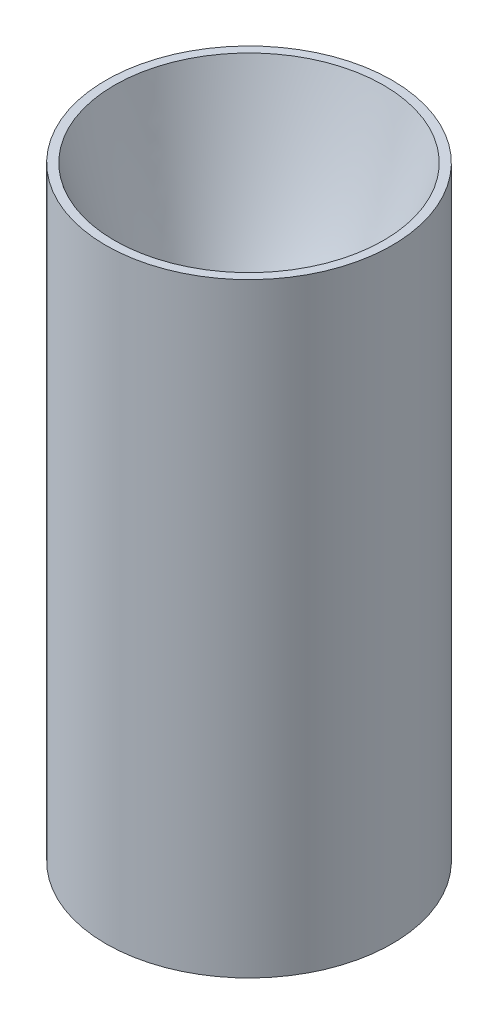
ISO-10303-21;
HEADER;
FILE_DESCRIPTION(('STEP AP214'),'2;1');
FILE_NAME('part.step','',(''),(''),'','','');
FILE_SCHEMA(('AUTOMOTIVE_DESIGN { 1 0 10303 214 1 1 1 1 }'));
ENDSEC;
DATA;
#1=APPLICATION_CONTEXT('core data for automotive mechanical design processes');
#2=APPLICATION_PROTOCOL_DEFINITION('international standard','automotive_design',2000,#1);
#3=PRODUCT_CONTEXT('',#1,'mechanical');
#4=PRODUCT('Part','Part','',(#3));
#5=PRODUCT_RELATED_PRODUCT_CATEGORY('part','',(#4));
#6=PRODUCT_DEFINITION_FORMATION('','',#4);
#7=PRODUCT_DEFINITION_CONTEXT('part definition',#1,'design');
#8=PRODUCT_DEFINITION('design','',#6,#7);
#9=PRODUCT_DEFINITION_SHAPE('','',#8);
#10=(LENGTH_UNIT() NAMED_UNIT(*) SI_UNIT(.MILLI.,.METRE.));
#11=(NAMED_UNIT(*) PLANE_ANGLE_UNIT() SI_UNIT($,.RADIAN.));
#12=(NAMED_UNIT(*) SI_UNIT($,.STERADIAN.) SOLID_ANGLE_UNIT());
#13=UNCERTAINTY_MEASURE_WITH_UNIT(LENGTH_MEASURE(1.E-05),#10,'distance_accuracy_value','');
#14=(GEOMETRIC_REPRESENTATION_CONTEXT(3) GLOBAL_UNCERTAINTY_ASSIGNED_CONTEXT((#13)) GLOBAL_UNIT_ASSIGNED_CONTEXT((#10,
#11,#12)) REPRESENTATION_CONTEXT('',''));
#15=CARTESIAN_POINT('',(0.,0.,0.));
#16=DIRECTION('',(0.,0.,1.));
#17=DIRECTION('',(1.,0.,0.));
#18=AXIS2_PLACEMENT_3D('',#15,#16,#17);
#19=CARTESIAN_POINT('',(26.7062113287053,6.50923965033825,0.));
#20=CARTESIAN_POINT('',(26.6554523867853,6.45847884124841,0.));
#21=CARTESIAN_POINT('',(26.5813741961518,6.38212177902064,0.));
#22=CARTESIAN_POINT('',(26.4154873738352,6.20864164611654,0.));
#23=CARTESIAN_POINT('',(26.2772778817675,6.04995163656635,0.));
#24=CARTESIAN_POINT('',(26.089808500155,5.83291364729743,0.));
#25=CARTESIAN_POINT('',(25.9153376003489,5.61072754276574,0.));
#26=CARTESIAN_POINT('',(25.7027203959471,5.32551893593357,0.));
#27=CARTESIAN_POINT('',(25.5134468469557,5.04570386122365,0.));
#28=CARTESIAN_POINT('',(25.3274206305271,4.75130157548285,0.));
#29=CARTESIAN_POINT('',(25.1569443484507,4.45478312275658,0.));
#30=CARTESIAN_POINT('',(24.995002426509,4.14928218433454,0.));
#31=CARTESIAN_POINT('',(24.8462181027666,3.83966673272222,0.));
#32=CARTESIAN_POINT('',(24.7081288971286,3.52362715719563,0.));
#33=CARTESIAN_POINT('',(24.5825511965105,3.20334704099946,0.));
#34=CARTESIAN_POINT('',(24.4686735390696,2.87809264472723,0.));
#35=CARTESIAN_POINT('',(24.3672556972351,2.54923942069524,0.));
#36=CARTESIAN_POINT('',(24.2780737272776,2.21635441997579,0.));
#37=CARTESIAN_POINT('',(24.2014758273978,1.88099677694374,0.));
#38=CARTESIAN_POINT('',(24.1374314313173,1.54205049780854,0.));
#39=CARTESIAN_POINT('',(24.0861168447955,1.20253727286862,0.));
#40=CARTESIAN_POINT('',(24.0523672130417,0.901433327840423,0.));
#41=CARTESIAN_POINT('',(24.0314657247247,0.646764266269616,0.));
#42=CARTESIAN_POINT('',(24.0193936938296,0.427064117093707,0.));
#43=CARTESIAN_POINT('',(24.0129558487222,0.267641069384235,0.));
#44=CARTESIAN_POINT('',(24.0105384573959,0.11011368951911,0.));
#45=CARTESIAN_POINT('',(24.0100006264442,0.0358926521759333,0.));
#46=CARTESIAN_POINT('',(24.01,1.20494413205813E-13,0.));
#47=B_SPLINE_CURVE_WITH_KNOTS('',4,(#19,#20,#21,#22,#23,#24,#25,#26,#27,#28,#29,#30,#31,#32,#33,
#34,#35,#36,#37,#38,#39,#40,#41,#42,#43,#44,#45,#46),.UNSPECIFIED.,.F.,.F.,(5,1,1,1,1,1,1,1,1,1,
1,1,1,1,1,1,1,1,1,1,1,1,1,1,5),(0.0825688161645696,0.122284452541055,0.142142270729318,
0.162000088917581,0.201715725294151,0.241431361670644,0.281146998047181,0.320862634423759,
0.360578270800262,0.400293907176806,0.440009543553384,0.479725179929891,0.519440816306429,
0.55915645268299,0.598872089059496,0.638587725436031,0.678303361812587,0.718018998189109,
0.75773463456565,0.797450270942201,0.837165907318734,0.857023725507005,0.876881543695275,
0.896739361883545,0.916597180071815),.UNSPECIFIED.);
#48=CARTESIAN_POINT('',(0.,0.,0.));
#49=DIRECTION('',(0.,1.,0.));
#50=AXIS1_PLACEMENT('',#48,#49);
#51=SURFACE_OF_REVOLUTION('',#47,#50);
#52=CARTESIAN_POINT('',(0.,-4.52382992584223E-09,0.));
#53=DIRECTION('',(0.,1.,0.));
#54=DIRECTION('',(0.,0.,1.));
#55=AXIS2_PLACEMENT_3D('',#52,#53,#54);
#56=CIRCLE('',#55,24.0100000000001);
#57=CARTESIAN_POINT('',(0.,-4.52382992584223E-09,24.0100000000001));
#58=VERTEX_POINT('',#57);
#59=EDGE_CURVE('E11',#58,#58,#56,.T.);
#60=ORIENTED_EDGE('',*,*,#59,.F.);
#61=EDGE_LOOP('',(#60));
#62=FACE_BOUND('',#61,.T.);
#63=CARTESIAN_POINT('',(0.,6.50923965033824,0.));
#64=DIRECTION('',(0.,1.,0.));
#65=DIRECTION('',(0.,0.,1.));
#66=AXIS2_PLACEMENT_3D('',#63,#64,#65);
#67=CIRCLE('',#66,26.7062113287053);
#68=CARTESIAN_POINT('',(0.,6.50923965033824,26.7062113287053));
#69=VERTEX_POINT('',#68);
#70=EDGE_CURVE('E132',#69,#69,#67,.T.);
#71=ORIENTED_EDGE('',*,*,#70,.T.);
#72=EDGE_LOOP('',(#71));
#73=FACE_BOUND('',#72,.T.);
#74=ADVANCED_FACE('F43',(#62,#73),#51,.T.);
#75=CARTESIAN_POINT('',(24.0100000000001,-4.52382992584223E-09,0.));
#76=CARTESIAN_POINT('',(24.0100012308518,-0.0705286470659472,0.));
#77=CARTESIAN_POINT('',(24.010530378306,-0.213584189693987,0.));
#78=CARTESIAN_POINT('',(24.0129060641596,-0.543182915887101,0.));
#79=CARTESIAN_POINT('',(24.0192304589117,-0.824160396612426,0.));
#80=CARTESIAN_POINT('',(24.0287155807421,-1.19482207151543,0.));
#81=CARTESIAN_POINT('',(24.0413578742,-1.51343505810577,0.));
#82=CARTESIAN_POINT('',(24.0571580988053,-1.86193960301196,0.));
#83=CARTESIAN_POINT('',(24.0761133579757,-2.19370687153936,0.));
#84=CARTESIAN_POINT('',(24.1037509729681,-2.61806939966552,0.));
#85=CARTESIAN_POINT('',(24.143219180703,-3.12203394655826,0.));
#86=CARTESIAN_POINT('',(24.2142318425549,-3.87997867466868,0.));
#87=CARTESIAN_POINT('',(24.3340588159477,-4.88645038793639,0.));
#88=CARTESIAN_POINT('',(24.5104181846956,-6.05671076009981,0.));
#89=CARTESIAN_POINT('',(24.7618173770714,-7.38516641453088,0.));
#90=CARTESIAN_POINT('',(25.062727460737,-8.70357451419277,0.));
#91=CARTESIAN_POINT('',(25.4127027740451,-10.0096372082404,0.));
#92=CARTESIAN_POINT('',(25.8112931373698,-11.3018195962222,0.));
#93=CARTESIAN_POINT('',(26.2578775488837,-12.5780993343875,0.));
#94=CARTESIAN_POINT('',(26.7519354830003,-13.8368874833426,0.));
#95=CARTESIAN_POINT('',(27.2926052852433,-15.0761971280278,0.));
#96=CARTESIAN_POINT('',(27.8794115530235,-16.2946097928945,0.));
#97=CARTESIAN_POINT('',(28.5110715670915,-17.4899387928883,0.));
#98=CARTESIAN_POINT('',(29.1874645682643,-18.6612877558523,0.));
#99=CARTESIAN_POINT('',(29.9063772771411,-19.8057433951625,0.));
#100=CARTESIAN_POINT('',(30.6689541775102,-20.9238600732815,0.));
#101=CARTESIAN_POINT('',(31.3700993731017,-21.8744117586503,0.));
#102=CARTESIAN_POINT('',(31.9996683054841,-22.6734454787298,0.));
#103=CARTESIAN_POINT('',(32.5350606005056,-23.3204221363905,0.));
#104=CARTESIAN_POINT('',(32.9831879534788,-23.8400050145822,0.));
#105=CARTESIAN_POINT('',(33.4193822127479,-24.3298162442334,0.));
#106=CARTESIAN_POINT('',(33.8467583090794,-24.7884843877114,0.));
#107=CARTESIAN_POINT('',(34.156490828318,-25.1138683080783,0.));
#108=CARTESIAN_POINT('',(34.4477921468583,-25.4096490446469,0.));
#109=CARTESIAN_POINT('',(34.547344615062,-25.5099499299107,0.));
#110=CARTESIAN_POINT('',(34.5972149928953,-25.5598221148951,0.));
#111=B_SPLINE_CURVE_WITH_KNOTS('',4,(#75,#76,#77,#78,#79,#80,#81,#82,#83,#84,#85,#86,#87,#88,
#89,#90,#91,#92,#93,#94,#95,#96,#97,#98,#99,#100,#101,#102,#103,#104,#105,#106,#107,#108,#109,
#110),.UNSPECIFIED.,.F.,.F.,(5,1,1,1,1,1,1,1,1,1,1,1,1,1,1,1,1,1,1,1,1,1,1,1,1,1,1,1,1,1,1,1,5),
(0.0826377293579618,0.0925749264345495,0.10251212335078,0.11244932026701,0.122386517183241,
0.132323714099471,0.142260911015702,0.152198107931932,0.162135304848163,0.182009698680624,
0.201884092513085,0.241632880178006,0.281381667842927,0.321130455507848,0.360879243172768,
0.400628030837689,0.44037681850261,0.480125606167531,0.519874393832452,0.559623181497373,
0.599371969162294,0.639120756827214,0.678869544492136,0.718618332157059,0.758367119821983,
0.798115907486907,0.817990301319368,0.837864695151829,0.857739088984291,0.877613482816753,
0.897487876649217,0.907425073565449,0.917362270319031),.UNSPECIFIED.);
#112=CARTESIAN_POINT('',(0.,0.,0.));
#113=DIRECTION('',(0.,1.,0.));
#114=AXIS1_PLACEMENT('',#112,#113);
#115=SURFACE_OF_REVOLUTION('',#111,#114);
#116=CARTESIAN_POINT('',(0.,-25.5598221117057,0.));
#117=DIRECTION('',(0.,1.,0.));
#118=DIRECTION('',(0.,0.,1.));
#119=AXIS2_PLACEMENT_3D('',#116,#117,#118);
#120=CIRCLE('',#119,34.5972149896735);
#121=CARTESIAN_POINT('',(0.,-25.5598221117057,34.5972149896735));
#122=VERTEX_POINT('',#121);
#123=EDGE_CURVE('E51',#122,#122,#120,.T.);
#124=ORIENTED_EDGE('',*,*,#123,.F.);
#125=EDGE_LOOP('',(#124));
#126=FACE_BOUND('',#125,.T.);
#127=ORIENTED_EDGE('',*,*,#59,.T.);
#128=EDGE_LOOP('',(#127));
#129=FACE_BOUND('',#128,.T.);
#130=ADVANCED_FACE('F151',(#126,#129),#115,.T.);
#131=CARTESIAN_POINT('',(0.,-25.5598221117057,0.));
#132=DIRECTION('',(0.,-1.,0.));
#133=DIRECTION('',(0.,0.,-1.));
#134=AXIS2_PLACEMENT_3D('',#131,#132,#133);
#135=CONICAL_SURFACE('',#134,34.5972149896735,0.785398163436918);
#136=CARTESIAN_POINT('',(0.,-34.1674502996624,0.));
#137=DIRECTION('',(0.,1.,0.));
#138=DIRECTION('',(0.,0.,1.));
#139=AXIS2_PLACEMENT_3D('',#136,#137,#138);
#140=CIRCLE('',#139,43.2048431783097);
#141=CARTESIAN_POINT('',(0.,-34.1674502996624,43.2048431783097));
#142=VERTEX_POINT('',#141);
#143=EDGE_CURVE('E209',#142,#142,#140,.T.);
#144=ORIENTED_EDGE('',*,*,#143,.F.);
#145=EDGE_LOOP('',(#144));
#146=FACE_BOUND('',#145,.T.);
#147=ORIENTED_EDGE('',*,*,#123,.T.);
#148=EDGE_LOOP('',(#147));
#149=FACE_BOUND('',#148,.T.);
#150=ADVANCED_FACE('F154',(#146,#149),#135,.F.);
#151=CARTESIAN_POINT('',(43.2048431783097,-34.1674502996624,0.));
#152=CARTESIAN_POINT('',(43.254715337891,-34.2173226978548,0.));
#153=CARTESIAN_POINT('',(43.3553242604632,-34.3186769291988,0.));
#154=CARTESIAN_POINT('',(43.58500459691,-34.5517100897781,0.));
#155=CARTESIAN_POINT('',(43.7848568169995,-34.7605007878418,0.));
#156=CARTESIAN_POINT('',(44.0923896993112,-35.0847918183622,0.));
#157=CARTESIAN_POINT('',(44.4257083902588,-35.4471532866296,0.));
#158=CARTESIAN_POINT('',(44.8260591537302,-35.8944082575379,0.));
#159=CARTESIAN_POINT('',(45.2637498918353,-36.4035419020669,0.));
#160=CARTESIAN_POINT('',(45.8044701559397,-37.0558327363716,0.));
#161=CARTESIAN_POINT('',(46.4308012880053,-37.8516123918643,0.));
#162=CARTESIAN_POINT('',(47.1340343764134,-38.8042368379484,0.));
#163=CARTESIAN_POINT('',(47.8954077706532,-39.9211332473901,0.));
#164=CARTESIAN_POINT('',(48.6150574927695,-41.0663154610566,0.));
#165=CARTESIAN_POINT('',(49.2910525077326,-42.2372538134368,0.));
#166=CARTESIAN_POINT('',(49.9229932184258,-43.4328620932277,0.));
#167=CARTESIAN_POINT('',(50.5096660570207,-44.6511293642919,0.));
#168=CARTESIAN_POINT('',(51.0504526793793,-45.890568959998,0.));
#169=CARTESIAN_POINT('',(51.5444701636213,-47.1492956161268,0.));
#170=CARTESIAN_POINT('',(51.9352810845023,-48.2661297682614,0.));
#171=CARTESIAN_POINT('',(52.2402216965071,-49.233238281383,0.));
#172=CARTESIAN_POINT('',(52.5209465915437,-50.207649576206,0.));
#173=CARTESIAN_POINT('',(52.7773074985867,-51.1886996185019,0.));
#174=CARTESIAN_POINT('',(53.0029965763988,-52.1776033538827,0.));
#175=CARTESIAN_POINT('',(53.1977432229395,-53.1725857701448,0.));
#176=CARTESIAN_POINT('',(53.3676081983682,-54.1725959586661,0.));
#177=CARTESIAN_POINT('',(53.4883592828742,-55.0083263874434,0.));
#178=CARTESIAN_POINT('',(53.5882208827225,-55.8486408917357,0.));
#179=CARTESIAN_POINT('',(53.6671255619154,-56.6881586902042,0.));
#180=CARTESIAN_POINT('',(53.7113377318368,-57.2811204236693,0.));
#181=CARTESIAN_POINT('',(53.741350078454,-57.7817549668458,0.));
#182=CARTESIAN_POINT('',(53.7611009111116,-58.2129981457044,0.));
#183=CARTESIAN_POINT('',(53.7737438122835,-58.5327280114938,0.));
#184=CARTESIAN_POINT('',(53.7832293035651,-58.9049560163774,0.));
#185=CARTESIAN_POINT('',(53.7895539055528,-59.1817251400827,0.));
#186=CARTESIAN_POINT('',(53.7919297596037,-59.5155666265266,0.));
#187=CARTESIAN_POINT('',(53.7924589041706,-59.6571436801761,0.));
#188=CARTESIAN_POINT('',(53.7924601363152,-59.7276737333537,0.));
#189=B_SPLINE_CURVE_WITH_KNOTS('',4,(#151,#152,#153,#154,#155,#156,#157,#158,#159,#160,#161,
#162,#163,#164,#165,#166,#167,#168,#169,#170,#171,#172,#173,#174,#175,#176,#177,#178,#179,#180,
#181,#182,#183,#184,#185,#186,#187,#188),.UNSPECIFIED.,.F.,.F.,(5,1,1,1,1,1,1,1,1,1,1,1,1,1,1,1,
1,1,1,1,1,1,1,1,1,1,1,1,1,1,1,1,1,1,5),(0.0826377289308518,0.0925749252641085,0.102512122180341,
0.112449319096573,0.122386516012805,0.142260909845266,0.162135303677727,0.182009697510188,
0.201884091342649,0.24163287900757,0.281381666672492,0.321130454337413,0.360879242002335,
0.400628029667257,0.440376817332178,0.4801256049971,0.519874392662021,0.559623180326942,
0.599371967991863,0.619246361824324,0.639120755656786,0.678869543321707,0.718618330986628,
0.738492724819089,0.75836711865155,0.798115906316471,0.817990300148932,0.837864693981393,
0.857739087813854,0.867676284730084,0.877613481646315,0.887550678562545,0.897487875478776,
0.907425072395006,0.917362269898702),.UNSPECIFIED.);
#190=CARTESIAN_POINT('',(0.,0.,0.));
#191=DIRECTION('',(0.,1.,0.));
#192=AXIS1_PLACEMENT('',#190,#191);
#193=SURFACE_OF_REVOLUTION('',#189,#192);
#194=CARTESIAN_POINT('',(0.,-59.7276737499237,0.));
#195=DIRECTION('',(0.,1.,0.));
#196=DIRECTION('',(0.,0.,1.));
#197=AXIS2_PLACEMENT_3D('',#194,#195,#196);
#198=CIRCLE('',#197,53.7924601363156);
#199=CARTESIAN_POINT('',(0.,-59.7276737499237,53.7924601363156));
#200=VERTEX_POINT('',#199);
#201=EDGE_CURVE('E206',#200,#200,#198,.T.);
#202=ORIENTED_EDGE('',*,*,#201,.F.);
#203=EDGE_LOOP('',(#202));
#204=FACE_BOUND('',#203,.T.);
#205=ORIENTED_EDGE('',*,*,#143,.T.);
#206=EDGE_LOOP('',(#205));
#207=FACE_BOUND('',#206,.T.);
#208=ADVANCED_FACE('F158',(#204,#207),#193,.T.);
#209=CARTESIAN_POINT('',(0.,0.,0.));
#210=DIRECTION('',(0.,1.,0.));
#211=DIRECTION('',(0.,0.,1.));
#212=AXIS2_PLACEMENT_3D('',#209,#210,#211);
#213=CYLINDRICAL_SURFACE('',#212,53.7924601363156);
#214=CARTESIAN_POINT('',(0.,-212.127673749924,0.));
#215=DIRECTION('',(0.,1.,0.));
#216=DIRECTION('',(0.,0.,1.));
#217=AXIS2_PLACEMENT_3D('',#214,#215,#216);
#218=CIRCLE('',#217,53.7924601363156);
#219=CARTESIAN_POINT('',(0.,-212.127673749924,53.7924601363156));
#220=VERTEX_POINT('',#219);
#221=EDGE_CURVE('E203',#220,#220,#218,.T.);
#222=ORIENTED_EDGE('',*,*,#221,.F.);
#223=EDGE_LOOP('',(#222));
#224=FACE_BOUND('',#223,.T.);
#225=ORIENTED_EDGE('',*,*,#201,.T.);
#226=EDGE_LOOP('',(#225));
#227=FACE_BOUND('',#226,.T.);
#228=ADVANCED_FACE('F162',(#224,#227),#213,.F.);
#229=CARTESIAN_POINT('',(76.2,-212.127673749924,0.));
#230=DIRECTION('',(0.,1.,0.));
#231=DIRECTION('',(0.,0.,1.));
#232=AXIS2_PLACEMENT_3D('',#229,#230,#231);
#233=PLANE('',#232);
#234=CARTESIAN_POINT('',(47.1463446356136,-212.127673749924,47.1463446356125));
#235=DIRECTION('',(0.,-1.,0.));
#236=DIRECTION('',(0.,0.,-1.));
#237=AXIS2_PLACEMENT_3D('',#234,#235,#236);
#238=CIRCLE('',#237,4.21639999999999);
#239=CARTESIAN_POINT('',(47.1463446356136,-212.127673749924,42.9299446356125));
#240=VERTEX_POINT('',#239);
#241=EDGE_CURVE('E87',#240,#240,#238,.T.);
#242=ORIENTED_EDGE('',*,*,#241,.F.);
#243=EDGE_LOOP('',(#242));
#244=FACE_BOUND('',#243,.T.);
#245=CARTESIAN_POINT('',(6.98383554802098E-13,-212.127673749924,66.675));
#246=DIRECTION('',(0.,-1.,0.));
#247=DIRECTION('',(0.,0.,-1.));
#248=AXIS2_PLACEMENT_3D('',#245,#246,#247);
#249=CIRCLE('',#248,4.21639999999999);
#250=CARTESIAN_POINT('',(6.98383554802098E-13,-212.127673749924,62.4586));
#251=VERTEX_POINT('',#250);
#252=EDGE_CURVE('E86',#251,#251,#249,.T.);
#253=ORIENTED_EDGE('',*,*,#252,.F.);
#254=EDGE_LOOP('',(#253));
#255=FACE_BOUND('',#254,.T.);
#256=CARTESIAN_POINT('',(-47.1463446356126,-212.127673749924,47.1463446356135));
#257=DIRECTION('',(0.,-1.,0.));
#258=DIRECTION('',(0.,0.,-1.));
#259=AXIS2_PLACEMENT_3D('',#256,#257,#258);
#260=CIRCLE('',#259,4.21639999999999);
#261=CARTESIAN_POINT('',(-47.1463446356126,-212.127673749924,42.9299446356135));
#262=VERTEX_POINT('',#261);
#263=EDGE_CURVE('E97',#262,#262,#260,.T.);
#264=ORIENTED_EDGE('',*,*,#263,.F.);
#265=EDGE_LOOP('',(#264));
#266=FACE_BOUND('',#265,.T.);
#267=CARTESIAN_POINT('',(-66.675,-212.127673749924,0.));
#268=DIRECTION('',(0.,-1.,0.));
#269=DIRECTION('',(0.,0.,-1.));
#270=AXIS2_PLACEMENT_3D('',#267,#268,#269);
#271=CIRCLE('',#270,4.21639999999999);
#272=CARTESIAN_POINT('',(-66.675,-212.127673749924,-4.21639999999999));
#273=VERTEX_POINT('',#272);
#274=EDGE_CURVE('E103',#273,#273,#271,.T.);
#275=ORIENTED_EDGE('',*,*,#274,.F.);
#276=EDGE_LOOP('',(#275));
#277=FACE_BOUND('',#276,.T.);
#278=CARTESIAN_POINT('',(-47.1463446356133,-212.127673749924,-47.1463446356128));
#279=DIRECTION('',(0.,-1.,0.));
#280=DIRECTION('',(0.,0.,-1.));
#281=AXIS2_PLACEMENT_3D('',#278,#279,#280);
#282=CIRCLE('',#281,4.21639999999999);
#283=CARTESIAN_POINT('',(-47.1463446356133,-212.127673749924,-51.3627446356128));
#284=VERTEX_POINT('',#283);
#285=EDGE_CURVE('E109',#284,#284,#282,.T.);
#286=ORIENTED_EDGE('',*,*,#285,.F.);
#287=EDGE_LOOP('',(#286));
#288=FACE_BOUND('',#287,.T.);
#289=CARTESIAN_POINT('',(-2.32794518267366E-13,-212.127673749924,-66.675));
#290=DIRECTION('',(0.,-1.,0.));
#291=DIRECTION('',(0.,0.,-1.));
#292=AXIS2_PLACEMENT_3D('',#289,#290,#291);
#293=CIRCLE('',#292,4.21639999999999);
#294=CARTESIAN_POINT('',(-2.32794518267366E-13,-212.127673749924,-70.8914));
#295=VERTEX_POINT('',#294);
#296=EDGE_CURVE('E115',#295,#295,#293,.T.);
#297=ORIENTED_EDGE('',*,*,#296,.F.);
#298=EDGE_LOOP('',(#297));
#299=FACE_BOUND('',#298,.T.);
#300=CARTESIAN_POINT('',(47.146344635613,-212.127673749924,-47.1463446356132));
#301=DIRECTION('',(0.,-1.,0.));
#302=DIRECTION('',(0.,0.,-1.));
#303=AXIS2_PLACEMENT_3D('',#300,#301,#302);
#304=CIRCLE('',#303,4.21639999999999);
#305=CARTESIAN_POINT('',(47.146344635613,-212.127673749924,-51.3627446356131));
#306=VERTEX_POINT('',#305);
#307=EDGE_CURVE('E121',#306,#306,#304,.T.);
#308=ORIENTED_EDGE('',*,*,#307,.F.);
#309=EDGE_LOOP('',(#308));
#310=FACE_BOUND('',#309,.T.);
#311=CARTESIAN_POINT('',(66.675,-212.127673749924,0.));
#312=DIRECTION('',(0.,-1.,0.));
#313=DIRECTION('',(0.,0.,-1.));
#314=AXIS2_PLACEMENT_3D('',#311,#312,#313);
#315=CIRCLE('',#314,4.21639999999999);
#316=CARTESIAN_POINT('',(66.675,-212.127673749924,-4.21639999999999));
#317=VERTEX_POINT('',#316);
#318=EDGE_CURVE('E127',#317,#317,#315,.T.);
#319=ORIENTED_EDGE('',*,*,#318,.F.);
#320=EDGE_LOOP('',(#319));
#321=FACE_BOUND('',#320,.T.);
#322=CARTESIAN_POINT('',(0.,-212.127673749924,0.));
#323=DIRECTION('',(0.,1.,0.));
#324=DIRECTION('',(0.,0.,1.));
#325=AXIS2_PLACEMENT_3D('',#322,#323,#324);
#326=CIRCLE('',#325,76.2);
#327=CARTESIAN_POINT('',(0.,-212.127673749924,76.2));
#328=VERTEX_POINT('',#327);
#329=EDGE_CURVE('E200',#328,#328,#326,.T.);
#330=ORIENTED_EDGE('',*,*,#329,.F.);
#331=EDGE_LOOP('',(#330));
#332=FACE_BOUND('',#331,.T.);
#333=ORIENTED_EDGE('',*,*,#221,.T.);
#334=EDGE_LOOP('',(#333));
#335=FACE_BOUND('',#334,.T.);
#336=ADVANCED_FACE('F166',(#244,#255,#266,#277,#288,#299,#310,#321,#332,#335),#233,.F.);
#337=CARTESIAN_POINT('',(0.,0.,0.));
#338=DIRECTION('',(0.,1.,0.));
#339=DIRECTION('',(0.,0.,1.));
#340=AXIS2_PLACEMENT_3D('',#337,#338,#339);
#341=CYLINDRICAL_SURFACE('',#340,76.2);
#342=CARTESIAN_POINT('',(0.,109.927347076635,0.));
#343=DIRECTION('',(0.,1.,0.));
#344=DIRECTION('',(0.,0.,1.));
#345=AXIS2_PLACEMENT_3D('',#342,#343,#344);
#346=CIRCLE('',#345,76.2);
#347=CARTESIAN_POINT('',(0.,109.927347076635,76.2));
#348=VERTEX_POINT('',#347);
#349=EDGE_CURVE('E197',#348,#348,#346,.T.);
#350=ORIENTED_EDGE('',*,*,#349,.F.);
#351=EDGE_LOOP('',(#350));
#352=FACE_BOUND('',#351,.T.);
#353=ORIENTED_EDGE('',*,*,#329,.T.);
#354=EDGE_LOOP('',(#353));
#355=FACE_BOUND('',#354,.T.);
#356=ADVANCED_FACE('F170',(#352,#355),#341,.T.);
#357=CARTESIAN_POINT('',(71.6384554787615,109.927347076635,0.));
#358=DIRECTION('',(0.,-1.,0.));
#359=DIRECTION('',(0.,0.,-1.));
#360=AXIS2_PLACEMENT_3D('',#357,#358,#359);
#361=PLANE('',#360);
#362=CARTESIAN_POINT('',(0.,109.927347076635,0.));
#363=DIRECTION('',(0.,1.,0.));
#364=DIRECTION('',(0.,0.,1.));
#365=AXIS2_PLACEMENT_3D('',#362,#363,#364);
#366=CIRCLE('',#365,71.6384554787615);
#367=CARTESIAN_POINT('',(0.,109.927347076635,71.6384554787615));
#368=VERTEX_POINT('',#367);
#369=EDGE_CURVE('E194',#368,#368,#366,.T.);
#370=ORIENTED_EDGE('',*,*,#369,.F.);
#371=EDGE_LOOP('',(#370));
#372=FACE_BOUND('',#371,.T.);
#373=ORIENTED_EDGE('',*,*,#349,.T.);
#374=EDGE_LOOP('',(#373));
#375=FACE_BOUND('',#374,.T.);
#376=ADVANCED_FACE('F174',(#372,#375),#361,.F.);
#377=CARTESIAN_POINT('',(71.6384554787615,109.927347076635,0.));
#378=CARTESIAN_POINT('',(49.1723334607279,34.6359542236987,0.));
#379=CARTESIAN_POINT('',(26.7062113287053,6.50923965033824,0.));
#380=B_SPLINE_CURVE_WITH_KNOTS('',2,(#377,#378,#379),.UNSPECIFIED.,.F.,.F.,(3,3),(0.,1.),.UNSPECIFIED.);
#381=CARTESIAN_POINT('',(0.,0.,0.));
#382=DIRECTION('',(0.,1.,0.));
#383=AXIS1_PLACEMENT('',#381,#382);
#384=SURFACE_OF_REVOLUTION('',#380,#383);
#385=ORIENTED_EDGE('',*,*,#70,.F.);
#386=EDGE_LOOP('',(#385));
#387=FACE_BOUND('',#386,.T.);
#388=ORIENTED_EDGE('',*,*,#369,.T.);
#389=EDGE_LOOP('',(#388));
#390=FACE_BOUND('',#389,.T.);
#391=ADVANCED_FACE('F178',(#387,#390),#384,.T.);
#392=CARTESIAN_POINT('',(66.675,-187.126453749924,0.));
#393=DIRECTION('',(0.,-1.,0.));
#394=DIRECTION('',(0.,0.,-1.));
#395=AXIS2_PLACEMENT_3D('',#392,#393,#394);
#396=CONICAL_SURFACE('',#395,4.21639999999999,1.02974425867665);
#397=CARTESIAN_POINT('',(66.675,-184.592985035856,0.));
#398=VERTEX_POINT('',#397);
#399=VERTEX_LOOP('',#398);
#400=FACE_BOUND('',#399,.T.);
#401=CARTESIAN_POINT('',(66.675,-187.126453749924,0.));
#402=DIRECTION('',(0.,-1.,0.));
#403=DIRECTION('',(0.,0.,-1.));
#404=AXIS2_PLACEMENT_3D('',#401,#402,#403);
#405=CIRCLE('',#404,4.21639999999999);
#406=CARTESIAN_POINT('',(66.675,-187.126453749924,-4.21639999999999));
#407=VERTEX_POINT('',#406);
#408=EDGE_CURVE('E130',#407,#407,#405,.T.);
#409=ORIENTED_EDGE('',*,*,#408,.T.);
#410=EDGE_LOOP('',(#409));
#411=FACE_BOUND('',#410,.T.);
#412=ADVANCED_FACE('F182',(#400,#411),#396,.F.);
#413=CARTESIAN_POINT('',(66.675,-212.127673749924,0.));
#414=DIRECTION('',(0.,-1.,0.));
#415=DIRECTION('',(0.,0.,-1.));
#416=AXIS2_PLACEMENT_3D('',#413,#414,#415);
#417=CYLINDRICAL_SURFACE('',#416,4.21639999999999);
#418=ORIENTED_EDGE('',*,*,#408,.F.);
#419=EDGE_LOOP('',(#418));
#420=FACE_BOUND('',#419,.T.);
#421=ORIENTED_EDGE('',*,*,#318,.T.);
#422=EDGE_LOOP('',(#421));
#423=FACE_BOUND('',#422,.T.);
#424=ADVANCED_FACE('F275',(#420,#423),#417,.F.);
#425=CARTESIAN_POINT('',(47.146344635613,-187.126453749924,-47.1463446356132));
#426=DIRECTION('',(0.,-1.,0.));
#427=DIRECTION('',(0.,0.,-1.));
#428=AXIS2_PLACEMENT_3D('',#425,#426,#427);
#429=CONICAL_SURFACE('',#428,4.21639999999999,1.02974425867665);
#430=CARTESIAN_POINT('',(47.146344635613,-184.592985035856,-47.1463446356132));
#431=VERTEX_POINT('',#430);
#432=VERTEX_LOOP('',#431);
#433=FACE_BOUND('',#432,.T.);
#434=CARTESIAN_POINT('',(47.146344635613,-187.126453749924,-47.1463446356132));
#435=DIRECTION('',(0.,-1.,0.));
#436=DIRECTION('',(0.,0.,-1.));
#437=AXIS2_PLACEMENT_3D('',#434,#435,#436);
#438=CIRCLE('',#437,4.21639999999999);
#439=CARTESIAN_POINT('',(47.146344635613,-187.126453749924,-51.3627446356131));
#440=VERTEX_POINT('',#439);
#441=EDGE_CURVE('E124',#440,#440,#438,.T.);
#442=ORIENTED_EDGE('',*,*,#441,.T.);
#443=EDGE_LOOP('',(#442));
#444=FACE_BOUND('',#443,.T.);
#445=ADVANCED_FACE('F282',(#433,#444),#429,.F.);
#446=CARTESIAN_POINT('',(47.146344635613,-212.127673749924,-47.1463446356132));
#447=DIRECTION('',(0.,-1.,0.));
#448=DIRECTION('',(0.,0.,-1.));
#449=AXIS2_PLACEMENT_3D('',#446,#447,#448);
#450=CYLINDRICAL_SURFACE('',#449,4.21639999999999);
#451=ORIENTED_EDGE('',*,*,#441,.F.);
#452=EDGE_LOOP('',(#451));
#453=FACE_BOUND('',#452,.T.);
#454=ORIENTED_EDGE('',*,*,#307,.T.);
#455=EDGE_LOOP('',(#454));
#456=FACE_BOUND('',#455,.T.);
#457=ADVANCED_FACE('F291',(#453,#456),#450,.F.);
#458=CARTESIAN_POINT('',(-2.32794518267366E-13,-187.126453749924,-66.675));
#459=DIRECTION('',(0.,-1.,0.));
#460=DIRECTION('',(0.,0.,-1.));
#461=AXIS2_PLACEMENT_3D('',#458,#459,#460);
#462=CONICAL_SURFACE('',#461,4.21639999999999,1.02974425867665);
#463=CARTESIAN_POINT('',(-2.39538571947206E-13,-184.592985035856,-66.675));
#464=VERTEX_POINT('',#463);
#465=VERTEX_LOOP('',#464);
#466=FACE_BOUND('',#465,.T.);
#467=CARTESIAN_POINT('',(-2.32794518267366E-13,-187.126453749924,-66.675));
#468=DIRECTION('',(0.,-1.,0.));
#469=DIRECTION('',(0.,0.,-1.));
#470=AXIS2_PLACEMENT_3D('',#467,#468,#469);
#471=CIRCLE('',#470,4.21639999999999);
#472=CARTESIAN_POINT('',(-2.32794518267366E-13,-187.126453749924,-70.8914));
#473=VERTEX_POINT('',#472);
#474=EDGE_CURVE('E118',#473,#473,#471,.T.);
#475=ORIENTED_EDGE('',*,*,#474,.T.);
#476=EDGE_LOOP('',(#475));
#477=FACE_BOUND('',#476,.T.);
#478=ADVANCED_FACE('F300',(#466,#477),#462,.F.);
#479=CARTESIAN_POINT('',(-2.32794518267366E-13,-212.127673749924,-66.675));
#480=DIRECTION('',(0.,-1.,0.));
#481=DIRECTION('',(0.,0.,-1.));
#482=AXIS2_PLACEMENT_3D('',#479,#480,#481);
#483=CYLINDRICAL_SURFACE('',#482,4.21639999999999);
#484=ORIENTED_EDGE('',*,*,#474,.F.);
#485=EDGE_LOOP('',(#484));
#486=FACE_BOUND('',#485,.T.);
#487=ORIENTED_EDGE('',*,*,#296,.T.);
#488=EDGE_LOOP('',(#487));
#489=FACE_BOUND('',#488,.T.);
#490=ADVANCED_FACE('F309',(#486,#489),#483,.F.);
#491=CARTESIAN_POINT('',(-47.1463446356133,-187.126453749924,-47.1463446356128));
#492=DIRECTION('',(0.,-1.,0.));
#493=DIRECTION('',(0.,0.,-1.));
#494=AXIS2_PLACEMENT_3D('',#491,#492,#493);
#495=CONICAL_SURFACE('',#494,4.21639999999999,1.02974425867665);
#496=CARTESIAN_POINT('',(-47.1463446356133,-184.592985035856,-47.1463446356128));
#497=VERTEX_POINT('',#496);
#498=VERTEX_LOOP('',#497);
#499=FACE_BOUND('',#498,.T.);
#500=CARTESIAN_POINT('',(-47.1463446356133,-187.126453749924,-47.1463446356128));
#501=DIRECTION('',(0.,-1.,0.));
#502=DIRECTION('',(0.,0.,-1.));
#503=AXIS2_PLACEMENT_3D('',#500,#501,#502);
#504=CIRCLE('',#503,4.21639999999999);
#505=CARTESIAN_POINT('',(-47.1463446356133,-187.126453749924,-51.3627446356128));
#506=VERTEX_POINT('',#505);
#507=EDGE_CURVE('E112',#506,#506,#504,.T.);
#508=ORIENTED_EDGE('',*,*,#507,.T.);
#509=EDGE_LOOP('',(#508));
#510=FACE_BOUND('',#509,.T.);
#511=ADVANCED_FACE('F318',(#499,#510),#495,.F.);
#512=CARTESIAN_POINT('',(-47.1463446356133,-212.127673749924,-47.1463446356128));
#513=DIRECTION('',(0.,-1.,0.));
#514=DIRECTION('',(0.,0.,-1.));
#515=AXIS2_PLACEMENT_3D('',#512,#513,#514);
#516=CYLINDRICAL_SURFACE('',#515,4.21639999999999);
#517=ORIENTED_EDGE('',*,*,#507,.F.);
#518=EDGE_LOOP('',(#517));
#519=FACE_BOUND('',#518,.T.);
#520=ORIENTED_EDGE('',*,*,#285,.T.);
#521=EDGE_LOOP('',(#520));
#522=FACE_BOUND('',#521,.T.);
#523=ADVANCED_FACE('F328',(#519,#522),#516,.F.);
#524=CARTESIAN_POINT('',(-66.675,-187.126453749924,0.));
#525=DIRECTION('',(0.,-1.,0.));
#526=DIRECTION('',(0.,0.,-1.));
#527=AXIS2_PLACEMENT_3D('',#524,#525,#526);
#528=CONICAL_SURFACE('',#527,4.21639999999999,1.02974425867665);
#529=CARTESIAN_POINT('',(-66.675,-184.592985035856,0.));
#530=VERTEX_POINT('',#529);
#531=VERTEX_LOOP('',#530);
#532=FACE_BOUND('',#531,.T.);
#533=CARTESIAN_POINT('',(-66.675,-187.126453749924,0.));
#534=DIRECTION('',(0.,-1.,0.));
#535=DIRECTION('',(0.,0.,-1.));
#536=AXIS2_PLACEMENT_3D('',#533,#534,#535);
#537=CIRCLE('',#536,4.21639999999999);
#538=CARTESIAN_POINT('',(-66.675,-187.126453749924,-4.21639999999999));
#539=VERTEX_POINT('',#538);
#540=EDGE_CURVE('E106',#539,#539,#537,.T.);
#541=ORIENTED_EDGE('',*,*,#540,.T.);
#542=EDGE_LOOP('',(#541));
#543=FACE_BOUND('',#542,.T.);
#544=ADVANCED_FACE('F336',(#532,#543),#528,.F.);
#545=CARTESIAN_POINT('',(-66.675,-212.127673749924,0.));
#546=DIRECTION('',(0.,-1.,0.));
#547=DIRECTION('',(0.,0.,-1.));
#548=AXIS2_PLACEMENT_3D('',#545,#546,#547);
#549=CYLINDRICAL_SURFACE('',#548,4.21639999999999);
#550=ORIENTED_EDGE('',*,*,#540,.F.);
#551=EDGE_LOOP('',(#550));
#552=FACE_BOUND('',#551,.T.);
#553=ORIENTED_EDGE('',*,*,#274,.T.);
#554=EDGE_LOOP('',(#553));
#555=FACE_BOUND('',#554,.T.);
#556=ADVANCED_FACE('F345',(#552,#555),#549,.F.);
#557=CARTESIAN_POINT('',(-47.1463446356126,-187.126453749924,47.1463446356135));
#558=DIRECTION('',(0.,-1.,0.));
#559=DIRECTION('',(0.,0.,-1.));
#560=AXIS2_PLACEMENT_3D('',#557,#558,#559);
#561=CONICAL_SURFACE('',#560,4.21639999999999,1.02974425867665);
#562=CARTESIAN_POINT('',(-47.1463446356127,-184.592985035856,47.1463446356135));
#563=VERTEX_POINT('',#562);
#564=VERTEX_LOOP('',#563);
#565=FACE_BOUND('',#564,.T.);
#566=CARTESIAN_POINT('',(-47.1463446356126,-187.126453749924,47.1463446356135));
#567=DIRECTION('',(0.,-1.,0.));
#568=DIRECTION('',(0.,0.,-1.));
#569=AXIS2_PLACEMENT_3D('',#566,#567,#568);
#570=CIRCLE('',#569,4.21639999999999);
#571=CARTESIAN_POINT('',(-47.1463446356126,-187.126453749924,42.9299446356135));
#572=VERTEX_POINT('',#571);
#573=EDGE_CURVE('E100',#572,#572,#570,.T.);
#574=ORIENTED_EDGE('',*,*,#573,.T.);
#575=EDGE_LOOP('',(#574));
#576=FACE_BOUND('',#575,.T.);
#577=ADVANCED_FACE('F353',(#565,#576),#561,.F.);
#578=CARTESIAN_POINT('',(-47.1463446356126,-212.127673749924,47.1463446356135));
#579=DIRECTION('',(0.,-1.,0.));
#580=DIRECTION('',(0.,0.,-1.));
#581=AXIS2_PLACEMENT_3D('',#578,#579,#580);
#582=CYLINDRICAL_SURFACE('',#581,4.21639999999999);
#583=ORIENTED_EDGE('',*,*,#573,.F.);
#584=EDGE_LOOP('',(#583));
#585=FACE_BOUND('',#584,.T.);
#586=ORIENTED_EDGE('',*,*,#263,.T.);
#587=EDGE_LOOP('',(#586));
#588=FACE_BOUND('',#587,.T.);
#589=ADVANCED_FACE('F362',(#585,#588),#582,.F.);
#590=CARTESIAN_POINT('',(6.98383554802098E-13,-187.126453749924,66.675));
#591=DIRECTION('',(0.,-1.,0.));
#592=DIRECTION('',(0.,0.,-1.));
#593=AXIS2_PLACEMENT_3D('',#590,#591,#592);
#594=CONICAL_SURFACE('',#593,4.21639999999999,1.02974425867665);
#595=CARTESIAN_POINT('',(6.91639501122257E-13,-184.592985035856,66.675));
#596=VERTEX_POINT('',#595);
#597=VERTEX_LOOP('',#596);
#598=FACE_BOUND('',#597,.T.);
#599=CARTESIAN_POINT('',(6.98383554802098E-13,-187.126453749924,66.675));
#600=DIRECTION('',(0.,-1.,0.));
#601=DIRECTION('',(0.,0.,-1.));
#602=AXIS2_PLACEMENT_3D('',#599,#600,#601);
#603=CIRCLE('',#602,4.21639999999999);
#604=CARTESIAN_POINT('',(6.98383554802098E-13,-187.126453749924,62.4586));
#605=VERTEX_POINT('',#604);
#606=EDGE_CURVE('E90',#605,#605,#603,.T.);
#607=ORIENTED_EDGE('',*,*,#606,.T.);
#608=EDGE_LOOP('',(#607));
#609=FACE_BOUND('',#608,.T.);
#610=ADVANCED_FACE('F370',(#598,#609),#594,.F.);
#611=CARTESIAN_POINT('',(6.98383554802098E-13,-212.127673749924,66.675));
#612=DIRECTION('',(0.,-1.,0.));
#613=DIRECTION('',(0.,0.,-1.));
#614=AXIS2_PLACEMENT_3D('',#611,#612,#613);
#615=CYLINDRICAL_SURFACE('',#614,4.21639999999999);
#616=ORIENTED_EDGE('',*,*,#606,.F.);
#617=EDGE_LOOP('',(#616));
#618=FACE_BOUND('',#617,.T.);
#619=ORIENTED_EDGE('',*,*,#252,.T.);
#620=EDGE_LOOP('',(#619));
#621=FACE_BOUND('',#620,.T.);
#622=ADVANCED_FACE('F80',(#618,#621),#615,.F.);
#623=CARTESIAN_POINT('',(47.1463446356136,-187.126453749924,47.1463446356125));
#624=DIRECTION('',(0.,-1.,0.));
#625=DIRECTION('',(0.,0.,-1.));
#626=AXIS2_PLACEMENT_3D('',#623,#624,#625);
#627=CONICAL_SURFACE('',#626,4.21639999999999,1.02974425867665);
#628=CARTESIAN_POINT('',(47.1463446356136,-184.592985035856,47.1463446356125));
#629=VERTEX_POINT('',#628);
#630=VERTEX_LOOP('',#629);
#631=FACE_BOUND('',#630,.T.);
#632=CARTESIAN_POINT('',(47.1463446356136,-187.126453749924,47.1463446356125));
#633=DIRECTION('',(0.,-1.,0.));
#634=DIRECTION('',(0.,0.,-1.));
#635=AXIS2_PLACEMENT_3D('',#632,#633,#634);
#636=CIRCLE('',#635,4.21639999999999);
#637=CARTESIAN_POINT('',(47.1463446356136,-187.126453749924,42.9299446356125));
#638=VERTEX_POINT('',#637);
#639=EDGE_CURVE('E84',#638,#638,#636,.T.);
#640=ORIENTED_EDGE('',*,*,#639,.T.);
#641=EDGE_LOOP('',(#640));
#642=FACE_BOUND('',#641,.T.);
#643=ADVANCED_FACE('F76',(#631,#642),#627,.F.);
#644=CARTESIAN_POINT('',(47.1463446356136,-212.127673749924,47.1463446356125));
#645=DIRECTION('',(0.,-1.,0.));
#646=DIRECTION('',(0.,0.,-1.));
#647=AXIS2_PLACEMENT_3D('',#644,#645,#646);
#648=CYLINDRICAL_SURFACE('',#647,4.21639999999999);
#649=ORIENTED_EDGE('',*,*,#639,.F.);
#650=EDGE_LOOP('',(#649));
#651=FACE_BOUND('',#650,.T.);
#652=ORIENTED_EDGE('',*,*,#241,.T.);
#653=EDGE_LOOP('',(#652));
#654=FACE_BOUND('',#653,.T.);
#655=ADVANCED_FACE('F79',(#651,#654),#648,.F.);
#656=CLOSED_SHELL('',(#74,#130,#150,#208,#228,#336,#356,#376,#391,#412,#424,#445,#457,#478,#490,
#511,#523,#544,#556,#577,#589,#610,#622,#643,#655));
#657=MANIFOLD_SOLID_BREP('B2',#656);
#658=ADVANCED_BREP_SHAPE_REPRESENTATION('',(#18,#657),#14);
#659=SHAPE_DEFINITION_REPRESENTATION(#9,#658);
ENDSEC;
END-ISO-10303-21;
